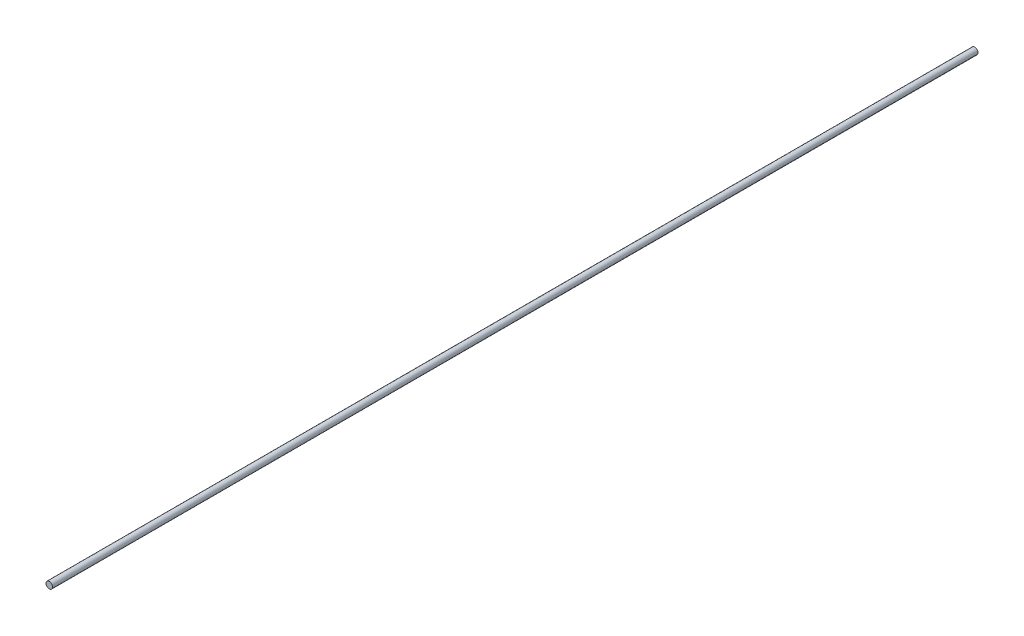
ISO-10303-21;
HEADER;
FILE_DESCRIPTION(('STEP AP214'),'2;1');
FILE_NAME('part.step','',(''),(''),'','','');
FILE_SCHEMA(('AUTOMOTIVE_DESIGN { 1 0 10303 214 1 1 1 1 }'));
ENDSEC;
DATA;
#1=APPLICATION_CONTEXT('core data for automotive mechanical design processes');
#2=APPLICATION_PROTOCOL_DEFINITION('international standard','automotive_design',2000,#1);
#3=PRODUCT_CONTEXT('',#1,'mechanical');
#4=PRODUCT('Part','Part','',(#3));
#5=PRODUCT_RELATED_PRODUCT_CATEGORY('part','',(#4));
#6=PRODUCT_DEFINITION_FORMATION('','',#4);
#7=PRODUCT_DEFINITION_CONTEXT('part definition',#1,'design');
#8=PRODUCT_DEFINITION('design','',#6,#7);
#9=PRODUCT_DEFINITION_SHAPE('','',#8);
#10=(LENGTH_UNIT() NAMED_UNIT(*) SI_UNIT(.MILLI.,.METRE.));
#11=(NAMED_UNIT(*) PLANE_ANGLE_UNIT() SI_UNIT($,.RADIAN.));
#12=(NAMED_UNIT(*) SI_UNIT($,.STERADIAN.) SOLID_ANGLE_UNIT());
#13=UNCERTAINTY_MEASURE_WITH_UNIT(LENGTH_MEASURE(1.E-05),#10,'distance_accuracy_value','');
#14=(GEOMETRIC_REPRESENTATION_CONTEXT(3) GLOBAL_UNCERTAINTY_ASSIGNED_CONTEXT((#13)) GLOBAL_UNIT_ASSIGNED_CONTEXT((#10,
#11,#12)) REPRESENTATION_CONTEXT('',''));
#15=CARTESIAN_POINT('',(0.,0.,0.));
#16=DIRECTION('',(0.,0.,1.));
#17=DIRECTION('',(1.,0.,0.));
#18=AXIS2_PLACEMENT_3D('',#15,#16,#17);
#19=CARTESIAN_POINT('',(0.,0.,2254.25));
#20=DIRECTION('',(0.,0.,-1.));
#21=DIRECTION('',(-1.,0.,0.));
#22=AXIS2_PLACEMENT_3D('',#19,#20,#21);
#23=CYLINDRICAL_SURFACE('',#22,7.9375);
#24=CARTESIAN_POINT('',(0.,0.,2254.25));
#25=DIRECTION('',(0.,0.,1.));
#26=DIRECTION('',(1.,0.,0.));
#27=AXIS2_PLACEMENT_3D('',#24,#25,#26);
#28=CIRCLE('',#27,7.9375);
#29=CARTESIAN_POINT('',(7.9375,0.,2254.25));
#30=VERTEX_POINT('',#29);
#31=EDGE_CURVE('E10',#30,#30,#28,.T.);
#32=ORIENTED_EDGE('',*,*,#31,.F.);
#33=EDGE_LOOP('',(#32));
#34=FACE_BOUND('',#33,.T.);
#35=CARTESIAN_POINT('',(0.,0.,0.));
#36=DIRECTION('',(0.,0.,1.));
#37=DIRECTION('',(1.,0.,0.));
#38=AXIS2_PLACEMENT_3D('',#35,#36,#37);
#39=CIRCLE('',#38,7.9375);
#40=CARTESIAN_POINT('',(7.9375,0.,0.));
#41=VERTEX_POINT('',#40);
#42=EDGE_CURVE('E39',#41,#41,#39,.T.);
#43=ORIENTED_EDGE('',*,*,#42,.T.);
#44=EDGE_LOOP('',(#43));
#45=FACE_BOUND('',#44,.T.);
#46=ADVANCED_FACE('F36',(#34,#45),#23,.T.);
#47=CARTESIAN_POINT('',(0.,0.,2254.25));
#48=DIRECTION('',(0.,0.,1.));
#49=DIRECTION('',(1.,0.,0.));
#50=AXIS2_PLACEMENT_3D('',#47,#48,#49);
#51=PLANE('',#50);
#52=ORIENTED_EDGE('',*,*,#31,.T.);
#53=EDGE_LOOP('',(#52));
#54=FACE_BOUND('',#53,.T.);
#55=ADVANCED_FACE('F51',(#54),#51,.T.);
#56=CARTESIAN_POINT('',(0.,0.,0.));
#57=DIRECTION('',(0.,0.,1.));
#58=DIRECTION('',(1.,0.,0.));
#59=AXIS2_PLACEMENT_3D('',#56,#57,#58);
#60=PLANE('',#59);
#61=ORIENTED_EDGE('',*,*,#42,.F.);
#62=EDGE_LOOP('',(#61));
#63=FACE_BOUND('',#62,.T.);
#64=ADVANCED_FACE('F49',(#63),#60,.F.);
#65=CLOSED_SHELL('',(#46,#55,#64));
#66=MANIFOLD_SOLID_BREP('B2',#65);
#67=ADVANCED_BREP_SHAPE_REPRESENTATION('',(#18,#66),#14);
#68=SHAPE_DEFINITION_REPRESENTATION(#9,#67);
ENDSEC;
END-ISO-10303-21;
